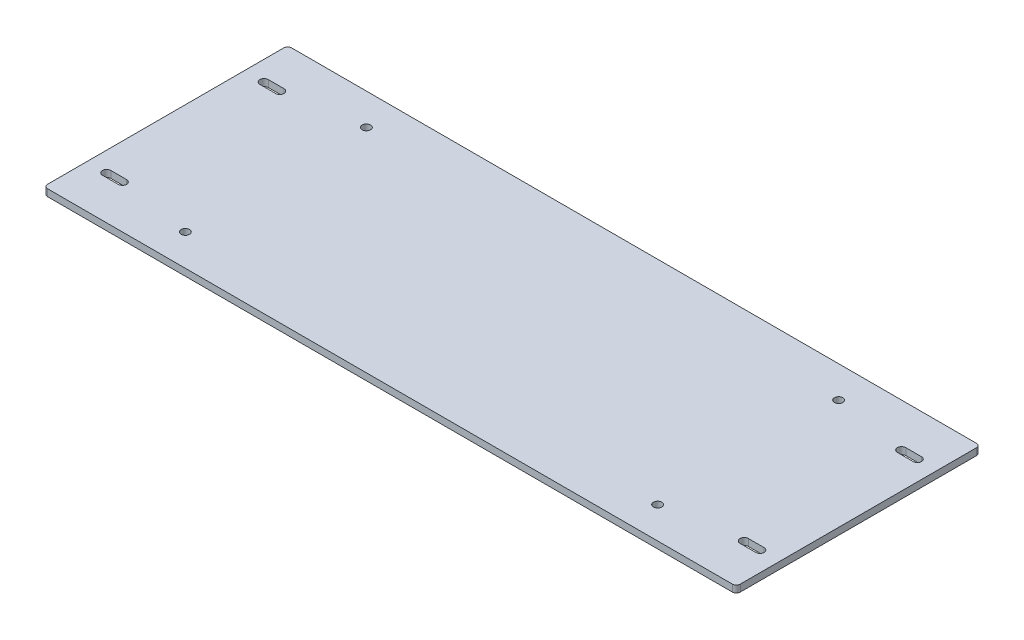
ISO-10303-21;
HEADER;
FILE_DESCRIPTION(('STEP AP214'),'2;1');
FILE_NAME('part.step','',(''),(''),'','','');
FILE_SCHEMA(('AUTOMOTIVE_DESIGN { 1 0 10303 214 1 1 1 1 }'));
ENDSEC;
DATA;
#1=APPLICATION_CONTEXT('core data for automotive mechanical design processes');
#2=APPLICATION_PROTOCOL_DEFINITION('international standard','automotive_design',2000,#1);
#3=PRODUCT_CONTEXT('',#1,'mechanical');
#4=PRODUCT('Part','Part','',(#3));
#5=PRODUCT_RELATED_PRODUCT_CATEGORY('part','',(#4));
#6=PRODUCT_DEFINITION_FORMATION('','',#4);
#7=PRODUCT_DEFINITION_CONTEXT('part definition',#1,'design');
#8=PRODUCT_DEFINITION('design','',#6,#7);
#9=PRODUCT_DEFINITION_SHAPE('','',#8);
#10=(LENGTH_UNIT() NAMED_UNIT(*) SI_UNIT(.MILLI.,.METRE.));
#11=(NAMED_UNIT(*) PLANE_ANGLE_UNIT() SI_UNIT($,.RADIAN.));
#12=(NAMED_UNIT(*) SI_UNIT($,.STERADIAN.) SOLID_ANGLE_UNIT());
#13=UNCERTAINTY_MEASURE_WITH_UNIT(LENGTH_MEASURE(1.E-05),#10,'distance_accuracy_value','');
#14=(GEOMETRIC_REPRESENTATION_CONTEXT(3) GLOBAL_UNCERTAINTY_ASSIGNED_CONTEXT((#13)) GLOBAL_UNIT_ASSIGNED_CONTEXT((#10,
#11,#12)) REPRESENTATION_CONTEXT('',''));
#15=CARTESIAN_POINT('',(0.,0.,0.));
#16=DIRECTION('',(0.,0.,1.));
#17=DIRECTION('',(1.,0.,0.));
#18=AXIS2_PLACEMENT_3D('',#15,#16,#17);
#19=CARTESIAN_POINT('',(0.,5.588,0.));
#20=DIRECTION('',(0.,-1.,0.));
#21=DIRECTION('',(0.,0.,-1.));
#22=AXIS2_PLACEMENT_3D('',#19,#20,#21);
#23=PLANE('',#22);
#24=CARTESIAN_POINT('',(469.9,5.588,-171.45));
#25=DIRECTION('',(0.,1.,0.));
#26=DIRECTION('',(0.,0.,1.));
#27=AXIS2_PLACEMENT_3D('',#24,#25,#26);
#28=CIRCLE('',#27,3.37819999999999);
#29=CARTESIAN_POINT('',(469.9,5.588,-168.0718));
#30=VERTEX_POINT('',#29);
#31=EDGE_CURVE('E870',#30,#30,#28,.T.);
#32=ORIENTED_EDGE('',*,*,#31,.F.);
#33=EDGE_LOOP('',(#32));
#34=FACE_BOUND('',#33,.T.);
#35=CARTESIAN_POINT('',(469.9,5.588,-25.4));
#36=DIRECTION('',(0.,1.,0.));
#37=DIRECTION('',(0.,0.,1.));
#38=AXIS2_PLACEMENT_3D('',#35,#36,#37);
#39=CIRCLE('',#38,3.37819999999999);
#40=CARTESIAN_POINT('',(469.9,5.588,-22.0218));
#41=VERTEX_POINT('',#40);
#42=EDGE_CURVE('E875',#41,#41,#39,.T.);
#43=ORIENTED_EDGE('',*,*,#42,.F.);
#44=EDGE_LOOP('',(#43));
#45=FACE_BOUND('',#44,.T.);
#46=CARTESIAN_POINT('',(88.9000000000001,5.588,-25.4));
#47=DIRECTION('',(0.,1.,0.));
#48=DIRECTION('',(0.,0.,1.));
#49=AXIS2_PLACEMENT_3D('',#46,#47,#48);
#50=CIRCLE('',#49,3.37819999999999);
#51=CARTESIAN_POINT('',(88.9000000000001,5.588,-22.0218));
#52=VERTEX_POINT('',#51);
#53=EDGE_CURVE('E890',#52,#52,#50,.T.);
#54=ORIENTED_EDGE('',*,*,#53,.F.);
#55=EDGE_LOOP('',(#54));
#56=FACE_BOUND('',#55,.T.);
#57=CARTESIAN_POINT('',(88.9,5.588,-171.45));
#58=DIRECTION('',(0.,1.,0.));
#59=DIRECTION('',(0.,0.,1.));
#60=AXIS2_PLACEMENT_3D('',#57,#58,#59);
#61=CIRCLE('',#60,3.37819999999999);
#62=CARTESIAN_POINT('',(88.9,5.588,-168.0718));
#63=VERTEX_POINT('',#62);
#64=EDGE_CURVE('E881',#63,#63,#61,.T.);
#65=ORIENTED_EDGE('',*,*,#64,.F.);
#66=EDGE_LOOP('',(#65));
#67=FACE_BOUND('',#66,.T.);
#68=CARTESIAN_POINT('',(542.925,5.588,-161.925));
#69=DIRECTION('',(0.,1.,0.));
#70=DIRECTION('',(0.,0.,1.));
#71=AXIS2_PLACEMENT_3D('',#68,#69,#70);
#72=CIRCLE('',#71,3.3782);
#73=CARTESIAN_POINT('',(542.925,5.588,-158.5468));
#74=VERTEX_POINT('',#73);
#75=CARTESIAN_POINT('',(542.925,5.588,-165.3032));
#76=VERTEX_POINT('',#75);
#77=EDGE_CURVE('E257',#74,#76,#72,.T.);
#78=ORIENTED_EDGE('',*,*,#77,.F.);
#79=DIRECTION('',(1.,0.,0.));
#80=VECTOR('',#79,1.);
#81=CARTESIAN_POINT('',(542.925,5.588,-158.5468));
#82=LINE('',#81,#80);
#83=CARTESIAN_POINT('',(530.225,5.588,-158.5468));
#84=VERTEX_POINT('',#83);
#85=EDGE_CURVE('E268',#84,#74,#82,.T.);
#86=ORIENTED_EDGE('',*,*,#85,.F.);
#87=CARTESIAN_POINT('',(530.225,5.588,-161.925));
#88=DIRECTION('',(0.,1.,0.));
#89=DIRECTION('',(0.,0.,1.));
#90=AXIS2_PLACEMENT_3D('',#87,#88,#89);
#91=CIRCLE('',#90,3.3782);
#92=CARTESIAN_POINT('',(530.225,5.588,-165.3032));
#93=VERTEX_POINT('',#92);
#94=EDGE_CURVE('E264',#93,#84,#91,.T.);
#95=ORIENTED_EDGE('',*,*,#94,.F.);
#96=DIRECTION('',(-1.,0.,0.));
#97=VECTOR('',#96,1.);
#98=CARTESIAN_POINT('',(542.925,5.588,-165.3032));
#99=LINE('',#98,#97);
#100=EDGE_CURVE('E260',#76,#93,#99,.T.);
#101=ORIENTED_EDGE('',*,*,#100,.F.);
#102=EDGE_LOOP('',(#78,#86,#95,#101));
#103=FACE_BOUND('',#102,.T.);
#104=CARTESIAN_POINT('',(15.875,5.588,-34.925));
#105=DIRECTION('',(0.,1.,0.));
#106=DIRECTION('',(0.,0.,1.));
#107=AXIS2_PLACEMENT_3D('',#104,#105,#106);
#108=CIRCLE('',#107,3.3782);
#109=CARTESIAN_POINT('',(15.875,5.588,-38.3032));
#110=VERTEX_POINT('',#109);
#111=CARTESIAN_POINT('',(15.875,5.588,-31.5468));
#112=VERTEX_POINT('',#111);
#113=EDGE_CURVE('E343',#110,#112,#108,.T.);
#114=ORIENTED_EDGE('',*,*,#113,.F.);
#115=DIRECTION('',(-1.,0.,0.));
#116=VECTOR('',#115,1.);
#117=CARTESIAN_POINT('',(15.875,5.588,-38.3032));
#118=LINE('',#117,#116);
#119=CARTESIAN_POINT('',(28.575,5.588,-38.3032));
#120=VERTEX_POINT('',#119);
#121=EDGE_CURVE('E354',#120,#110,#118,.T.);
#122=ORIENTED_EDGE('',*,*,#121,.F.);
#123=CARTESIAN_POINT('',(28.575,5.588,-34.925));
#124=DIRECTION('',(0.,1.,0.));
#125=DIRECTION('',(0.,0.,1.));
#126=AXIS2_PLACEMENT_3D('',#123,#124,#125);
#127=CIRCLE('',#126,3.3782);
#128=CARTESIAN_POINT('',(28.575,5.588,-31.5468));
#129=VERTEX_POINT('',#128);
#130=EDGE_CURVE('E350',#129,#120,#127,.T.);
#131=ORIENTED_EDGE('',*,*,#130,.F.);
#132=DIRECTION('',(1.,0.,0.));
#133=VECTOR('',#132,1.);
#134=CARTESIAN_POINT('',(15.875,5.588,-31.5468));
#135=LINE('',#134,#133);
#136=EDGE_CURVE('E346',#112,#129,#135,.T.);
#137=ORIENTED_EDGE('',*,*,#136,.F.);
#138=EDGE_LOOP('',(#114,#122,#131,#137));
#139=FACE_BOUND('',#138,.T.);
#140=DIRECTION('',(-1.,0.,0.));
#141=VECTOR('',#140,1.);
#142=CARTESIAN_POINT('',(0.,5.588,-196.85));
#143=LINE('',#142,#141);
#144=CARTESIAN_POINT('',(555.625,5.588,-196.85));
#145=VERTEX_POINT('',#144);
#146=CARTESIAN_POINT('',(3.175,5.588,-196.85));
#147=VERTEX_POINT('',#146);
#148=EDGE_CURVE('E397',#145,#147,#143,.T.);
#149=ORIENTED_EDGE('',*,*,#148,.T.);
#150=CARTESIAN_POINT('',(3.175,5.588,-193.675));
#151=DIRECTION('',(0.,-1.,0.));
#152=DIRECTION('',(0.,0.,-1.));
#153=AXIS2_PLACEMENT_3D('',#150,#151,#152);
#154=CIRCLE('',#153,3.175);
#155=CARTESIAN_POINT('',(0.,5.588,-193.675));
#156=VERTEX_POINT('',#155);
#157=EDGE_CURVE('E448',#147,#156,#154,.F.);
#158=ORIENTED_EDGE('',*,*,#157,.T.);
#159=DIRECTION('',(0.,0.,1.));
#160=VECTOR('',#159,1.);
#161=CARTESIAN_POINT('',(0.,5.588,0.));
#162=LINE('',#161,#160);
#163=CARTESIAN_POINT('',(0.,5.588,-3.175));
#164=VERTEX_POINT('',#163);
#165=EDGE_CURVE('E386',#156,#164,#162,.T.);
#166=ORIENTED_EDGE('',*,*,#165,.T.);
#167=CARTESIAN_POINT('',(3.175,5.588,-3.175));
#168=DIRECTION('',(0.,-1.,0.));
#169=DIRECTION('',(0.,0.,-1.));
#170=AXIS2_PLACEMENT_3D('',#167,#168,#169);
#171=CIRCLE('',#170,3.175);
#172=CARTESIAN_POINT('',(3.175,5.588,0.));
#173=VERTEX_POINT('',#172);
#174=EDGE_CURVE('E442',#164,#173,#171,.F.);
#175=ORIENTED_EDGE('',*,*,#174,.T.);
#176=DIRECTION('',(1.,0.,0.));
#177=VECTOR('',#176,1.);
#178=CARTESIAN_POINT('',(0.,5.588,0.));
#179=LINE('',#178,#177);
#180=CARTESIAN_POINT('',(555.625,5.588,0.));
#181=VERTEX_POINT('',#180);
#182=EDGE_CURVE('E390',#173,#181,#179,.T.);
#183=ORIENTED_EDGE('',*,*,#182,.T.);
#184=CARTESIAN_POINT('',(555.625,5.588,-3.175));
#185=DIRECTION('',(0.,-1.,0.));
#186=DIRECTION('',(0.,0.,-1.));
#187=AXIS2_PLACEMENT_3D('',#184,#185,#186);
#188=CIRCLE('',#187,3.175);
#189=CARTESIAN_POINT('',(558.8,5.588,-3.175));
#190=VERTEX_POINT('',#189);
#191=EDGE_CURVE('E59',#181,#190,#188,.F.);
#192=ORIENTED_EDGE('',*,*,#191,.T.);
#193=DIRECTION('',(0.,0.,-1.));
#194=VECTOR('',#193,1.);
#195=CARTESIAN_POINT('',(558.8,5.588,0.));
#196=LINE('',#195,#194);
#197=CARTESIAN_POINT('',(558.8,5.588,-193.675));
#198=VERTEX_POINT('',#197);
#199=EDGE_CURVE('E394',#190,#198,#196,.T.);
#200=ORIENTED_EDGE('',*,*,#199,.T.);
#201=CARTESIAN_POINT('',(555.625,5.588,-193.675));
#202=DIRECTION('',(0.,-1.,0.));
#203=DIRECTION('',(0.,0.,-1.));
#204=AXIS2_PLACEMENT_3D('',#201,#202,#203);
#205=CIRCLE('',#204,3.175);
#206=EDGE_CURVE('E445',#198,#145,#205,.F.);
#207=ORIENTED_EDGE('',*,*,#206,.T.);
#208=EDGE_LOOP('',(#149,#158,#166,#175,#183,#192,#200,#207));
#209=FACE_BOUND('',#208,.T.);
#210=CARTESIAN_POINT('',(15.875,5.588,-161.925));
#211=DIRECTION('',(0.,1.,0.));
#212=DIRECTION('',(0.,0.,1.));
#213=AXIS2_PLACEMENT_3D('',#210,#211,#212);
#214=CIRCLE('',#213,3.3782);
#215=CARTESIAN_POINT('',(15.875,5.588,-165.3032));
#216=VERTEX_POINT('',#215);
#217=CARTESIAN_POINT('',(15.875,5.588,-158.5468));
#218=VERTEX_POINT('',#217);
#219=EDGE_CURVE('E300',#216,#218,#214,.T.);
#220=ORIENTED_EDGE('',*,*,#219,.F.);
#221=DIRECTION('',(-1.,0.,0.));
#222=VECTOR('',#221,1.);
#223=CARTESIAN_POINT('',(15.875,5.588,-165.3032));
#224=LINE('',#223,#222);
#225=CARTESIAN_POINT('',(28.575,5.588,-165.3032));
#226=VERTEX_POINT('',#225);
#227=EDGE_CURVE('E311',#226,#216,#224,.T.);
#228=ORIENTED_EDGE('',*,*,#227,.F.);
#229=CARTESIAN_POINT('',(28.575,5.588,-161.925));
#230=DIRECTION('',(0.,1.,0.));
#231=DIRECTION('',(0.,0.,1.));
#232=AXIS2_PLACEMENT_3D('',#229,#230,#231);
#233=CIRCLE('',#232,3.3782);
#234=CARTESIAN_POINT('',(28.575,5.588,-158.5468));
#235=VERTEX_POINT('',#234);
#236=EDGE_CURVE('E307',#235,#226,#233,.T.);
#237=ORIENTED_EDGE('',*,*,#236,.F.);
#238=DIRECTION('',(1.,0.,0.));
#239=VECTOR('',#238,1.);
#240=CARTESIAN_POINT('',(15.875,5.588,-158.5468));
#241=LINE('',#240,#239);
#242=EDGE_CURVE('E303',#218,#235,#241,.T.);
#243=ORIENTED_EDGE('',*,*,#242,.F.);
#244=EDGE_LOOP('',(#220,#228,#237,#243));
#245=FACE_BOUND('',#244,.T.);
#246=CARTESIAN_POINT('',(542.925,5.588,-34.925));
#247=DIRECTION('',(0.,1.,0.));
#248=DIRECTION('',(0.,0.,1.));
#249=AXIS2_PLACEMENT_3D('',#246,#247,#248);
#250=CIRCLE('',#249,3.37819999999999);
#251=CARTESIAN_POINT('',(542.925,5.588,-31.5468));
#252=VERTEX_POINT('',#251);
#253=CARTESIAN_POINT('',(542.925,5.588,-38.3032));
#254=VERTEX_POINT('',#253);
#255=EDGE_CURVE('E201',#252,#254,#250,.T.);
#256=ORIENTED_EDGE('',*,*,#255,.F.);
#257=DIRECTION('',(1.,0.,0.));
#258=VECTOR('',#257,1.);
#259=CARTESIAN_POINT('',(542.925,5.588,-31.5468));
#260=LINE('',#259,#258);
#261=CARTESIAN_POINT('',(530.225,5.588,-31.5468));
#262=VERTEX_POINT('',#261);
#263=EDGE_CURVE('E231',#262,#252,#260,.T.);
#264=ORIENTED_EDGE('',*,*,#263,.F.);
#265=CARTESIAN_POINT('',(530.225,5.588,-34.925));
#266=DIRECTION('',(0.,1.,0.));
#267=DIRECTION('',(0.,0.,1.));
#268=AXIS2_PLACEMENT_3D('',#265,#266,#267);
#269=CIRCLE('',#268,3.37819999999999);
#270=CARTESIAN_POINT('',(530.225,5.588,-38.3032));
#271=VERTEX_POINT('',#270);
#272=EDGE_CURVE('E226',#271,#262,#269,.T.);
#273=ORIENTED_EDGE('',*,*,#272,.F.);
#274=DIRECTION('',(-1.,0.,0.));
#275=VECTOR('',#274,1.);
#276=CARTESIAN_POINT('',(542.925,5.588,-38.3032));
#277=LINE('',#276,#275);
#278=EDGE_CURVE('E212',#254,#271,#277,.T.);
#279=ORIENTED_EDGE('',*,*,#278,.F.);
#280=EDGE_LOOP('',(#256,#264,#273,#279));
#281=FACE_BOUND('',#280,.T.);
#282=ADVANCED_FACE('F36',(#34,#45,#56,#67,#103,#139,#209,#245,#281),#23,.F.);
#283=CARTESIAN_POINT('',(0.,0.,0.));
#284=DIRECTION('',(0.,-1.,0.));
#285=DIRECTION('',(0.,0.,-1.));
#286=AXIS2_PLACEMENT_3D('',#283,#284,#285);
#287=PLANE('',#286);
#288=CARTESIAN_POINT('',(469.9,0.,-171.45));
#289=DIRECTION('',(0.,1.,0.));
#290=DIRECTION('',(0.,0.,1.));
#291=AXIS2_PLACEMENT_3D('',#288,#289,#290);
#292=CIRCLE('',#291,3.37819999999999);
#293=CARTESIAN_POINT('',(469.9,0.,-168.0718));
#294=VERTEX_POINT('',#293);
#295=EDGE_CURVE('E868',#294,#294,#292,.T.);
#296=ORIENTED_EDGE('',*,*,#295,.T.);
#297=EDGE_LOOP('',(#296));
#298=FACE_BOUND('',#297,.T.);
#299=CARTESIAN_POINT('',(469.9,0.,-25.4));
#300=DIRECTION('',(0.,1.,0.));
#301=DIRECTION('',(0.,0.,1.));
#302=AXIS2_PLACEMENT_3D('',#299,#300,#301);
#303=CIRCLE('',#302,3.37819999999999);
#304=CARTESIAN_POINT('',(469.9,0.,-22.0218));
#305=VERTEX_POINT('',#304);
#306=EDGE_CURVE('E897',#305,#305,#303,.T.);
#307=ORIENTED_EDGE('',*,*,#306,.T.);
#308=EDGE_LOOP('',(#307));
#309=FACE_BOUND('',#308,.T.);
#310=CARTESIAN_POINT('',(88.9000000000001,0.,-25.4));
#311=DIRECTION('',(0.,1.,0.));
#312=DIRECTION('',(0.,0.,1.));
#313=AXIS2_PLACEMENT_3D('',#310,#311,#312);
#314=CIRCLE('',#313,3.37819999999999);
#315=CARTESIAN_POINT('',(88.9000000000001,0.,-22.0218));
#316=VERTEX_POINT('',#315);
#317=EDGE_CURVE('E884',#316,#316,#314,.T.);
#318=ORIENTED_EDGE('',*,*,#317,.T.);
#319=EDGE_LOOP('',(#318));
#320=FACE_BOUND('',#319,.T.);
#321=CARTESIAN_POINT('',(88.9,0.,-171.45));
#322=DIRECTION('',(0.,1.,0.));
#323=DIRECTION('',(0.,0.,1.));
#324=AXIS2_PLACEMENT_3D('',#321,#322,#323);
#325=CIRCLE('',#324,3.37819999999999);
#326=CARTESIAN_POINT('',(88.9,0.,-168.0718));
#327=VERTEX_POINT('',#326);
#328=EDGE_CURVE('E240',#327,#327,#325,.T.);
#329=ORIENTED_EDGE('',*,*,#328,.T.);
#330=EDGE_LOOP('',(#329));
#331=FACE_BOUND('',#330,.T.);
#332=DIRECTION('',(0.,0.,1.));
#333=VECTOR('',#332,1.);
#334=CARTESIAN_POINT('',(0.,0.,0.));
#335=LINE('',#334,#333);
#336=CARTESIAN_POINT('',(0.,0.,-193.675));
#337=VERTEX_POINT('',#336);
#338=CARTESIAN_POINT('',(0.,0.,-3.175));
#339=VERTEX_POINT('',#338);
#340=EDGE_CURVE('E385',#337,#339,#335,.T.);
#341=ORIENTED_EDGE('',*,*,#340,.F.);
#342=CARTESIAN_POINT('',(3.175,0.,-193.675));
#343=DIRECTION('',(0.,-1.,0.));
#344=DIRECTION('',(0.,0.,-1.));
#345=AXIS2_PLACEMENT_3D('',#342,#343,#344);
#346=CIRCLE('',#345,3.175);
#347=CARTESIAN_POINT('',(3.175,0.,-196.85));
#348=VERTEX_POINT('',#347);
#349=EDGE_CURVE('E430',#337,#348,#346,.T.);
#350=ORIENTED_EDGE('',*,*,#349,.T.);
#351=DIRECTION('',(-1.,0.,0.));
#352=VECTOR('',#351,1.);
#353=CARTESIAN_POINT('',(0.,0.,-196.85));
#354=LINE('',#353,#352);
#355=CARTESIAN_POINT('',(555.625,0.,-196.85));
#356=VERTEX_POINT('',#355);
#357=EDGE_CURVE('E391',#356,#348,#354,.T.);
#358=ORIENTED_EDGE('',*,*,#357,.F.);
#359=CARTESIAN_POINT('',(555.625,0.,-193.675));
#360=DIRECTION('',(0.,-1.,0.));
#361=DIRECTION('',(0.,0.,-1.));
#362=AXIS2_PLACEMENT_3D('',#359,#360,#361);
#363=CIRCLE('',#362,3.175);
#364=CARTESIAN_POINT('',(558.8,0.,-193.675));
#365=VERTEX_POINT('',#364);
#366=EDGE_CURVE('E427',#356,#365,#363,.T.);
#367=ORIENTED_EDGE('',*,*,#366,.T.);
#368=DIRECTION('',(0.,0.,-1.));
#369=VECTOR('',#368,1.);
#370=CARTESIAN_POINT('',(558.8,0.,0.));
#371=LINE('',#370,#369);
#372=CARTESIAN_POINT('',(558.8,0.,-3.175));
#373=VERTEX_POINT('',#372);
#374=EDGE_CURVE('E409',#373,#365,#371,.T.);
#375=ORIENTED_EDGE('',*,*,#374,.F.);
#376=CARTESIAN_POINT('',(555.625,0.,-3.175));
#377=DIRECTION('',(0.,-1.,0.));
#378=DIRECTION('',(0.,0.,-1.));
#379=AXIS2_PLACEMENT_3D('',#376,#377,#378);
#380=CIRCLE('',#379,3.175);
#381=CARTESIAN_POINT('',(555.625,0.,0.));
#382=VERTEX_POINT('',#381);
#383=EDGE_CURVE('E421',#373,#382,#380,.T.);
#384=ORIENTED_EDGE('',*,*,#383,.T.);
#385=DIRECTION('',(1.,0.,0.));
#386=VECTOR('',#385,1.);
#387=CARTESIAN_POINT('',(0.,0.,0.));
#388=LINE('',#387,#386);
#389=CARTESIAN_POINT('',(3.175,0.,0.));
#390=VERTEX_POINT('',#389);
#391=EDGE_CURVE('E405',#390,#382,#388,.T.);
#392=ORIENTED_EDGE('',*,*,#391,.F.);
#393=CARTESIAN_POINT('',(3.175,0.,-3.175));
#394=DIRECTION('',(0.,-1.,0.));
#395=DIRECTION('',(0.,0.,-1.));
#396=AXIS2_PLACEMENT_3D('',#393,#394,#395);
#397=CIRCLE('',#396,3.175);
#398=EDGE_CURVE('E424',#390,#339,#397,.T.);
#399=ORIENTED_EDGE('',*,*,#398,.T.);
#400=EDGE_LOOP('',(#341,#350,#358,#367,#375,#384,#392,#399));
#401=FACE_BOUND('',#400,.T.);
#402=DIRECTION('',(-1.,0.,0.));
#403=VECTOR('',#402,1.);
#404=CARTESIAN_POINT('',(15.875,0.,-38.3032));
#405=LINE('',#404,#403);
#406=CARTESIAN_POINT('',(28.575,0.,-38.3032));
#407=VERTEX_POINT('',#406);
#408=CARTESIAN_POINT('',(15.875,0.,-38.3032));
#409=VERTEX_POINT('',#408);
#410=EDGE_CURVE('E347',#407,#409,#405,.T.);
#411=ORIENTED_EDGE('',*,*,#410,.T.);
#412=CARTESIAN_POINT('',(15.875,0.,-34.925));
#413=DIRECTION('',(0.,1.,0.));
#414=DIRECTION('',(0.,0.,1.));
#415=AXIS2_PLACEMENT_3D('',#412,#413,#414);
#416=CIRCLE('',#415,3.3782);
#417=CARTESIAN_POINT('',(15.875,0.,-31.5468));
#418=VERTEX_POINT('',#417);
#419=EDGE_CURVE('E342',#409,#418,#416,.T.);
#420=ORIENTED_EDGE('',*,*,#419,.T.);
#421=DIRECTION('',(1.,0.,0.));
#422=VECTOR('',#421,1.);
#423=CARTESIAN_POINT('',(15.875,0.,-31.5468));
#424=LINE('',#423,#422);
#425=CARTESIAN_POINT('',(28.575,0.,-31.5468));
#426=VERTEX_POINT('',#425);
#427=EDGE_CURVE('E361',#418,#426,#424,.T.);
#428=ORIENTED_EDGE('',*,*,#427,.T.);
#429=CARTESIAN_POINT('',(28.575,0.,-34.925));
#430=DIRECTION('',(0.,1.,0.));
#431=DIRECTION('',(0.,0.,1.));
#432=AXIS2_PLACEMENT_3D('',#429,#430,#431);
#433=CIRCLE('',#432,3.3782);
#434=EDGE_CURVE('E365',#426,#407,#433,.T.);
#435=ORIENTED_EDGE('',*,*,#434,.T.);
#436=EDGE_LOOP('',(#411,#420,#428,#435));
#437=FACE_BOUND('',#436,.T.);
#438=DIRECTION('',(-1.,0.,0.));
#439=VECTOR('',#438,1.);
#440=CARTESIAN_POINT('',(15.875,0.,-165.3032));
#441=LINE('',#440,#439);
#442=CARTESIAN_POINT('',(28.575,0.,-165.3032));
#443=VERTEX_POINT('',#442);
#444=CARTESIAN_POINT('',(15.875,0.,-165.3032));
#445=VERTEX_POINT('',#444);
#446=EDGE_CURVE('E304',#443,#445,#441,.T.);
#447=ORIENTED_EDGE('',*,*,#446,.T.);
#448=CARTESIAN_POINT('',(15.875,0.,-161.925));
#449=DIRECTION('',(0.,1.,0.));
#450=DIRECTION('',(0.,0.,1.));
#451=AXIS2_PLACEMENT_3D('',#448,#449,#450);
#452=CIRCLE('',#451,3.3782);
#453=CARTESIAN_POINT('',(15.875,0.,-158.5468));
#454=VERTEX_POINT('',#453);
#455=EDGE_CURVE('E299',#445,#454,#452,.T.);
#456=ORIENTED_EDGE('',*,*,#455,.T.);
#457=DIRECTION('',(1.,0.,0.));
#458=VECTOR('',#457,1.);
#459=CARTESIAN_POINT('',(15.875,0.,-158.5468));
#460=LINE('',#459,#458);
#461=CARTESIAN_POINT('',(28.575,0.,-158.5468));
#462=VERTEX_POINT('',#461);
#463=EDGE_CURVE('E318',#454,#462,#460,.T.);
#464=ORIENTED_EDGE('',*,*,#463,.T.);
#465=CARTESIAN_POINT('',(28.575,0.,-161.925));
#466=DIRECTION('',(0.,1.,0.));
#467=DIRECTION('',(0.,0.,1.));
#468=AXIS2_PLACEMENT_3D('',#465,#466,#467);
#469=CIRCLE('',#468,3.3782);
#470=EDGE_CURVE('E322',#462,#443,#469,.T.);
#471=ORIENTED_EDGE('',*,*,#470,.T.);
#472=EDGE_LOOP('',(#447,#456,#464,#471));
#473=FACE_BOUND('',#472,.T.);
#474=DIRECTION('',(1.,0.,0.));
#475=VECTOR('',#474,1.);
#476=CARTESIAN_POINT('',(542.925,0.,-158.5468));
#477=LINE('',#476,#475);
#478=CARTESIAN_POINT('',(530.225,0.,-158.5468));
#479=VERTEX_POINT('',#478);
#480=CARTESIAN_POINT('',(542.925,0.,-158.5468));
#481=VERTEX_POINT('',#480);
#482=EDGE_CURVE('E261',#479,#481,#477,.T.);
#483=ORIENTED_EDGE('',*,*,#482,.T.);
#484=CARTESIAN_POINT('',(542.925,0.,-161.925));
#485=DIRECTION('',(0.,1.,0.));
#486=DIRECTION('',(0.,0.,1.));
#487=AXIS2_PLACEMENT_3D('',#484,#485,#486);
#488=CIRCLE('',#487,3.3782);
#489=CARTESIAN_POINT('',(542.925,0.,-165.3032));
#490=VERTEX_POINT('',#489);
#491=EDGE_CURVE('E221',#481,#490,#488,.T.);
#492=ORIENTED_EDGE('',*,*,#491,.T.);
#493=DIRECTION('',(-1.,0.,0.));
#494=VECTOR('',#493,1.);
#495=CARTESIAN_POINT('',(542.925,0.,-165.3032));
#496=LINE('',#495,#494);
#497=CARTESIAN_POINT('',(530.225,0.,-165.3032));
#498=VERTEX_POINT('',#497);
#499=EDGE_CURVE('E275',#490,#498,#496,.T.);
#500=ORIENTED_EDGE('',*,*,#499,.T.);
#501=CARTESIAN_POINT('',(530.225,0.,-161.925));
#502=DIRECTION('',(0.,1.,0.));
#503=DIRECTION('',(0.,0.,1.));
#504=AXIS2_PLACEMENT_3D('',#501,#502,#503);
#505=CIRCLE('',#504,3.3782);
#506=EDGE_CURVE('E279',#498,#479,#505,.T.);
#507=ORIENTED_EDGE('',*,*,#506,.T.);
#508=EDGE_LOOP('',(#483,#492,#500,#507));
#509=FACE_BOUND('',#508,.T.);
#510=DIRECTION('',(1.,0.,0.));
#511=VECTOR('',#510,1.);
#512=CARTESIAN_POINT('',(542.925,0.,-31.5468));
#513=LINE('',#512,#511);
#514=CARTESIAN_POINT('',(530.225,0.,-31.5468));
#515=VERTEX_POINT('',#514);
#516=CARTESIAN_POINT('',(542.925,0.,-31.5468));
#517=VERTEX_POINT('',#516);
#518=EDGE_CURVE('E213',#515,#517,#513,.T.);
#519=ORIENTED_EDGE('',*,*,#518,.T.);
#520=CARTESIAN_POINT('',(542.925,0.,-34.925));
#521=DIRECTION('',(0.,1.,0.));
#522=DIRECTION('',(0.,0.,1.));
#523=AXIS2_PLACEMENT_3D('',#520,#521,#522);
#524=CIRCLE('',#523,3.37819999999999);
#525=CARTESIAN_POINT('',(542.925,0.,-38.3032));
#526=VERTEX_POINT('',#525);
#527=EDGE_CURVE('E237',#517,#526,#524,.T.);
#528=ORIENTED_EDGE('',*,*,#527,.T.);
#529=DIRECTION('',(-1.,0.,0.));
#530=VECTOR('',#529,1.);
#531=CARTESIAN_POINT('',(542.925,0.,-38.3032));
#532=LINE('',#531,#530);
#533=CARTESIAN_POINT('',(530.225,0.,-38.3032));
#534=VERTEX_POINT('',#533);
#535=EDGE_CURVE('E219',#526,#534,#532,.T.);
#536=ORIENTED_EDGE('',*,*,#535,.T.);
#537=CARTESIAN_POINT('',(530.225,0.,-34.925));
#538=DIRECTION('',(0.,1.,0.));
#539=DIRECTION('',(0.,0.,1.));
#540=AXIS2_PLACEMENT_3D('',#537,#538,#539);
#541=CIRCLE('',#540,3.37819999999999);
#542=EDGE_CURVE('E243',#534,#515,#541,.T.);
#543=ORIENTED_EDGE('',*,*,#542,.T.);
#544=EDGE_LOOP('',(#519,#528,#536,#543));
#545=FACE_BOUND('',#544,.T.);
#546=ADVANCED_FACE('F472',(#298,#309,#320,#331,#401,#437,#473,#509,#545),#287,.T.);
#547=CARTESIAN_POINT('',(0.,5.588,0.));
#548=DIRECTION('',(1.,0.,0.));
#549=DIRECTION('',(0.,0.,-1.));
#550=AXIS2_PLACEMENT_3D('',#547,#548,#549);
#551=PLANE('',#550);
#552=ORIENTED_EDGE('',*,*,#165,.F.);
#553=DIRECTION('',(0.,-1.,0.));
#554=VECTOR('',#553,1.);
#555=CARTESIAN_POINT('',(0.,5.588,-193.675));
#556=LINE('',#555,#554);
#557=EDGE_CURVE('E417',#156,#337,#556,.T.);
#558=ORIENTED_EDGE('',*,*,#557,.T.);
#559=ORIENTED_EDGE('',*,*,#340,.T.);
#560=DIRECTION('',(0.,-1.,0.));
#561=VECTOR('',#560,1.);
#562=CARTESIAN_POINT('',(0.,5.588,-3.175));
#563=LINE('',#562,#561);
#564=EDGE_CURVE('E401',#339,#164,#563,.F.);
#565=ORIENTED_EDGE('',*,*,#564,.T.);
#566=EDGE_LOOP('',(#552,#558,#559,#565));
#567=FACE_BOUND('',#566,.T.);
#568=ADVANCED_FACE('F489',(#567),#551,.F.);
#569=CARTESIAN_POINT('',(0.,5.588,0.));
#570=DIRECTION('',(0.,0.,-1.));
#571=DIRECTION('',(-1.,0.,0.));
#572=AXIS2_PLACEMENT_3D('',#569,#570,#571);
#573=PLANE('',#572);
#574=ORIENTED_EDGE('',*,*,#182,.F.);
#575=DIRECTION('',(0.,-1.,0.));
#576=VECTOR('',#575,1.);
#577=CARTESIAN_POINT('',(3.175,5.588,0.));
#578=LINE('',#577,#576);
#579=EDGE_CURVE('E11',#173,#390,#578,.T.);
#580=ORIENTED_EDGE('',*,*,#579,.T.);
#581=ORIENTED_EDGE('',*,*,#391,.T.);
#582=DIRECTION('',(0.,-1.,0.));
#583=VECTOR('',#582,1.);
#584=CARTESIAN_POINT('',(555.625,5.588,0.));
#585=LINE('',#584,#583);
#586=EDGE_CURVE('E45',#382,#181,#585,.F.);
#587=ORIENTED_EDGE('',*,*,#586,.T.);
#588=EDGE_LOOP('',(#574,#580,#581,#587));
#589=FACE_BOUND('',#588,.T.);
#590=ADVANCED_FACE('F461',(#589),#573,.F.);
#591=CARTESIAN_POINT('',(558.8,5.588,0.));
#592=DIRECTION('',(-1.,0.,0.));
#593=DIRECTION('',(0.,0.,1.));
#594=AXIS2_PLACEMENT_3D('',#591,#592,#593);
#595=PLANE('',#594);
#596=ORIENTED_EDGE('',*,*,#374,.T.);
#597=DIRECTION('',(0.,-1.,0.));
#598=VECTOR('',#597,1.);
#599=CARTESIAN_POINT('',(558.8,5.588,-193.675));
#600=LINE('',#599,#598);
#601=EDGE_CURVE('E52',#365,#198,#600,.F.);
#602=ORIENTED_EDGE('',*,*,#601,.T.);
#603=ORIENTED_EDGE('',*,*,#199,.F.);
#604=DIRECTION('',(0.,-1.,0.));
#605=VECTOR('',#604,1.);
#606=CARTESIAN_POINT('',(558.8,5.588,-3.175));
#607=LINE('',#606,#605);
#608=EDGE_CURVE('E451',#190,#373,#607,.T.);
#609=ORIENTED_EDGE('',*,*,#608,.T.);
#610=EDGE_LOOP('',(#596,#602,#603,#609));
#611=FACE_BOUND('',#610,.T.);
#612=ADVANCED_FACE('F469',(#611),#595,.F.);
#613=CARTESIAN_POINT('',(0.,5.588,-196.85));
#614=DIRECTION('',(0.,0.,1.));
#615=DIRECTION('',(1.,0.,0.));
#616=AXIS2_PLACEMENT_3D('',#613,#614,#615);
#617=PLANE('',#616);
#618=ORIENTED_EDGE('',*,*,#357,.T.);
#619=DIRECTION('',(0.,-1.,0.));
#620=VECTOR('',#619,1.);
#621=CARTESIAN_POINT('',(3.175,5.588,-196.85));
#622=LINE('',#621,#620);
#623=EDGE_CURVE('E437',#348,#147,#622,.F.);
#624=ORIENTED_EDGE('',*,*,#623,.T.);
#625=ORIENTED_EDGE('',*,*,#148,.F.);
#626=DIRECTION('',(0.,-1.,0.));
#627=VECTOR('',#626,1.);
#628=CARTESIAN_POINT('',(555.625,5.588,-196.85));
#629=LINE('',#628,#627);
#630=EDGE_CURVE('E433',#145,#356,#629,.T.);
#631=ORIENTED_EDGE('',*,*,#630,.T.);
#632=EDGE_LOOP('',(#618,#624,#625,#631));
#633=FACE_BOUND('',#632,.T.);
#634=ADVANCED_FACE('F481',(#633),#617,.F.);
#635=CARTESIAN_POINT('',(15.875,5.588,-34.925));
#636=DIRECTION('',(0.,-1.,0.));
#637=DIRECTION('',(0.,0.,-1.));
#638=AXIS2_PLACEMENT_3D('',#635,#636,#637);
#639=CYLINDRICAL_SURFACE('',#638,3.3782);
#640=ORIENTED_EDGE('',*,*,#419,.F.);
#641=DIRECTION('',(0.,-1.,0.));
#642=VECTOR('',#641,1.);
#643=CARTESIAN_POINT('',(15.875,5.588,-38.3032));
#644=LINE('',#643,#642);
#645=EDGE_CURVE('E357',#110,#409,#644,.T.);
#646=ORIENTED_EDGE('',*,*,#645,.F.);
#647=ORIENTED_EDGE('',*,*,#113,.T.);
#648=DIRECTION('',(0.,-1.,0.));
#649=VECTOR('',#648,1.);
#650=CARTESIAN_POINT('',(15.875,5.588,-31.5468));
#651=LINE('',#650,#649);
#652=EDGE_CURVE('E381',#112,#418,#651,.T.);
#653=ORIENTED_EDGE('',*,*,#652,.T.);
#654=EDGE_LOOP('',(#640,#646,#647,#653));
#655=FACE_BOUND('',#654,.T.);
#656=ADVANCED_FACE('F511',(#655),#639,.F.);
#657=CARTESIAN_POINT('',(15.875,5.588,-31.5468));
#658=DIRECTION('',(0.,0.,-1.));
#659=DIRECTION('',(-1.,0.,0.));
#660=AXIS2_PLACEMENT_3D('',#657,#658,#659);
#661=PLANE('',#660);
#662=ORIENTED_EDGE('',*,*,#427,.F.);
#663=ORIENTED_EDGE('',*,*,#652,.F.);
#664=ORIENTED_EDGE('',*,*,#136,.T.);
#665=DIRECTION('',(0.,-1.,0.));
#666=VECTOR('',#665,1.);
#667=CARTESIAN_POINT('',(28.575,5.588,-31.5468));
#668=LINE('',#667,#666);
#669=EDGE_CURVE('E378',#129,#426,#668,.T.);
#670=ORIENTED_EDGE('',*,*,#669,.T.);
#671=EDGE_LOOP('',(#662,#663,#664,#670));
#672=FACE_BOUND('',#671,.T.);
#673=ADVANCED_FACE('F581',(#672),#661,.T.);
#674=CARTESIAN_POINT('',(28.575,5.588,-34.925));
#675=DIRECTION('',(0.,-1.,0.));
#676=DIRECTION('',(0.,0.,-1.));
#677=AXIS2_PLACEMENT_3D('',#674,#675,#676);
#678=CYLINDRICAL_SURFACE('',#677,3.3782);
#679=ORIENTED_EDGE('',*,*,#434,.F.);
#680=ORIENTED_EDGE('',*,*,#669,.F.);
#681=ORIENTED_EDGE('',*,*,#130,.T.);
#682=DIRECTION('',(0.,-1.,0.));
#683=VECTOR('',#682,1.);
#684=CARTESIAN_POINT('',(28.575,5.588,-38.3032));
#685=LINE('',#684,#683);
#686=EDGE_CURVE('E375',#120,#407,#685,.T.);
#687=ORIENTED_EDGE('',*,*,#686,.T.);
#688=EDGE_LOOP('',(#679,#680,#681,#687));
#689=FACE_BOUND('',#688,.T.);
#690=ADVANCED_FACE('F578',(#689),#678,.F.);
#691=CARTESIAN_POINT('',(15.875,5.588,-38.3032));
#692=DIRECTION('',(0.,0.,1.));
#693=DIRECTION('',(1.,0.,0.));
#694=AXIS2_PLACEMENT_3D('',#691,#692,#693);
#695=PLANE('',#694);
#696=ORIENTED_EDGE('',*,*,#410,.F.);
#697=ORIENTED_EDGE('',*,*,#686,.F.);
#698=ORIENTED_EDGE('',*,*,#121,.T.);
#699=ORIENTED_EDGE('',*,*,#645,.T.);
#700=EDGE_LOOP('',(#696,#697,#698,#699));
#701=FACE_BOUND('',#700,.T.);
#702=ADVANCED_FACE('F574',(#701),#695,.T.);
#703=CARTESIAN_POINT('',(15.875,5.588,-161.925));
#704=DIRECTION('',(0.,-1.,0.));
#705=DIRECTION('',(0.,0.,-1.));
#706=AXIS2_PLACEMENT_3D('',#703,#704,#705);
#707=CYLINDRICAL_SURFACE('',#706,3.3782);
#708=ORIENTED_EDGE('',*,*,#455,.F.);
#709=DIRECTION('',(0.,-1.,0.));
#710=VECTOR('',#709,1.);
#711=CARTESIAN_POINT('',(15.875,5.588,-165.3032));
#712=LINE('',#711,#710);
#713=EDGE_CURVE('E314',#216,#445,#712,.T.);
#714=ORIENTED_EDGE('',*,*,#713,.F.);
#715=ORIENTED_EDGE('',*,*,#219,.T.);
#716=DIRECTION('',(0.,-1.,0.));
#717=VECTOR('',#716,1.);
#718=CARTESIAN_POINT('',(15.875,5.588,-158.5468));
#719=LINE('',#718,#717);
#720=EDGE_CURVE('E338',#218,#454,#719,.T.);
#721=ORIENTED_EDGE('',*,*,#720,.T.);
#722=EDGE_LOOP('',(#708,#714,#715,#721));
#723=FACE_BOUND('',#722,.T.);
#724=ADVANCED_FACE('F570',(#723),#707,.F.);
#725=CARTESIAN_POINT('',(15.875,5.588,-158.5468));
#726=DIRECTION('',(0.,0.,-1.));
#727=DIRECTION('',(-1.,0.,0.));
#728=AXIS2_PLACEMENT_3D('',#725,#726,#727);
#729=PLANE('',#728);
#730=ORIENTED_EDGE('',*,*,#463,.F.);
#731=ORIENTED_EDGE('',*,*,#720,.F.);
#732=ORIENTED_EDGE('',*,*,#242,.T.);
#733=DIRECTION('',(0.,-1.,0.));
#734=VECTOR('',#733,1.);
#735=CARTESIAN_POINT('',(28.575,5.588,-158.5468));
#736=LINE('',#735,#734);
#737=EDGE_CURVE('E335',#235,#462,#736,.T.);
#738=ORIENTED_EDGE('',*,*,#737,.T.);
#739=EDGE_LOOP('',(#730,#731,#732,#738));
#740=FACE_BOUND('',#739,.T.);
#741=ADVANCED_FACE('F566',(#740),#729,.T.);
#742=CARTESIAN_POINT('',(28.575,5.588,-161.925));
#743=DIRECTION('',(0.,-1.,0.));
#744=DIRECTION('',(0.,0.,-1.));
#745=AXIS2_PLACEMENT_3D('',#742,#743,#744);
#746=CYLINDRICAL_SURFACE('',#745,3.3782);
#747=ORIENTED_EDGE('',*,*,#470,.F.);
#748=ORIENTED_EDGE('',*,*,#737,.F.);
#749=ORIENTED_EDGE('',*,*,#236,.T.);
#750=DIRECTION('',(0.,-1.,0.));
#751=VECTOR('',#750,1.);
#752=CARTESIAN_POINT('',(28.575,5.588,-165.3032));
#753=LINE('',#752,#751);
#754=EDGE_CURVE('E332',#226,#443,#753,.T.);
#755=ORIENTED_EDGE('',*,*,#754,.T.);
#756=EDGE_LOOP('',(#747,#748,#749,#755));
#757=FACE_BOUND('',#756,.T.);
#758=ADVANCED_FACE('F562',(#757),#746,.F.);
#759=CARTESIAN_POINT('',(15.875,5.588,-165.3032));
#760=DIRECTION('',(0.,0.,1.));
#761=DIRECTION('',(1.,0.,0.));
#762=AXIS2_PLACEMENT_3D('',#759,#760,#761);
#763=PLANE('',#762);
#764=ORIENTED_EDGE('',*,*,#446,.F.);
#765=ORIENTED_EDGE('',*,*,#754,.F.);
#766=ORIENTED_EDGE('',*,*,#227,.T.);
#767=ORIENTED_EDGE('',*,*,#713,.T.);
#768=EDGE_LOOP('',(#764,#765,#766,#767));
#769=FACE_BOUND('',#768,.T.);
#770=ADVANCED_FACE('F558',(#769),#763,.T.);
#771=CARTESIAN_POINT('',(542.925,5.588,-161.925));
#772=DIRECTION('',(0.,-1.,0.));
#773=DIRECTION('',(0.,0.,-1.));
#774=AXIS2_PLACEMENT_3D('',#771,#772,#773);
#775=CYLINDRICAL_SURFACE('',#774,3.3782);
#776=ORIENTED_EDGE('',*,*,#491,.F.);
#777=DIRECTION('',(0.,-1.,0.));
#778=VECTOR('',#777,1.);
#779=CARTESIAN_POINT('',(542.925,5.588,-158.5468));
#780=LINE('',#779,#778);
#781=EDGE_CURVE('E271',#74,#481,#780,.T.);
#782=ORIENTED_EDGE('',*,*,#781,.F.);
#783=ORIENTED_EDGE('',*,*,#77,.T.);
#784=DIRECTION('',(0.,-1.,0.));
#785=VECTOR('',#784,1.);
#786=CARTESIAN_POINT('',(542.925,5.588,-165.3032));
#787=LINE('',#786,#785);
#788=EDGE_CURVE('E295',#76,#490,#787,.T.);
#789=ORIENTED_EDGE('',*,*,#788,.T.);
#790=EDGE_LOOP('',(#776,#782,#783,#789));
#791=FACE_BOUND('',#790,.T.);
#792=ADVANCED_FACE('F554',(#791),#775,.F.);
#793=CARTESIAN_POINT('',(542.925,5.588,-165.3032));
#794=DIRECTION('',(0.,0.,1.));
#795=DIRECTION('',(1.,0.,0.));
#796=AXIS2_PLACEMENT_3D('',#793,#794,#795);
#797=PLANE('',#796);
#798=ORIENTED_EDGE('',*,*,#499,.F.);
#799=ORIENTED_EDGE('',*,*,#788,.F.);
#800=ORIENTED_EDGE('',*,*,#100,.T.);
#801=DIRECTION('',(0.,-1.,0.));
#802=VECTOR('',#801,1.);
#803=CARTESIAN_POINT('',(530.225,5.588,-165.3032));
#804=LINE('',#803,#802);
#805=EDGE_CURVE('E292',#93,#498,#804,.T.);
#806=ORIENTED_EDGE('',*,*,#805,.T.);
#807=EDGE_LOOP('',(#798,#799,#800,#806));
#808=FACE_BOUND('',#807,.T.);
#809=ADVANCED_FACE('F550',(#808),#797,.T.);
#810=CARTESIAN_POINT('',(530.225,5.588,-161.925));
#811=DIRECTION('',(0.,-1.,0.));
#812=DIRECTION('',(0.,0.,-1.));
#813=AXIS2_PLACEMENT_3D('',#810,#811,#812);
#814=CYLINDRICAL_SURFACE('',#813,3.3782);
#815=ORIENTED_EDGE('',*,*,#506,.F.);
#816=ORIENTED_EDGE('',*,*,#805,.F.);
#817=ORIENTED_EDGE('',*,*,#94,.T.);
#818=DIRECTION('',(0.,-1.,0.));
#819=VECTOR('',#818,1.);
#820=CARTESIAN_POINT('',(530.225,5.588,-158.5468));
#821=LINE('',#820,#819);
#822=EDGE_CURVE('E289',#84,#479,#821,.T.);
#823=ORIENTED_EDGE('',*,*,#822,.T.);
#824=EDGE_LOOP('',(#815,#816,#817,#823));
#825=FACE_BOUND('',#824,.T.);
#826=ADVANCED_FACE('F546',(#825),#814,.F.);
#827=CARTESIAN_POINT('',(542.925,5.588,-158.5468));
#828=DIRECTION('',(0.,0.,-1.));
#829=DIRECTION('',(-1.,0.,0.));
#830=AXIS2_PLACEMENT_3D('',#827,#828,#829);
#831=PLANE('',#830);
#832=ORIENTED_EDGE('',*,*,#482,.F.);
#833=ORIENTED_EDGE('',*,*,#822,.F.);
#834=ORIENTED_EDGE('',*,*,#85,.T.);
#835=ORIENTED_EDGE('',*,*,#781,.T.);
#836=EDGE_LOOP('',(#832,#833,#834,#835));
#837=FACE_BOUND('',#836,.T.);
#838=ADVANCED_FACE('F543',(#837),#831,.T.);
#839=CARTESIAN_POINT('',(542.925,5.588,-34.925));
#840=DIRECTION('',(0.,-1.,0.));
#841=DIRECTION('',(0.,0.,-1.));
#842=AXIS2_PLACEMENT_3D('',#839,#840,#841);
#843=CYLINDRICAL_SURFACE('',#842,3.37819999999999);
#844=ORIENTED_EDGE('',*,*,#527,.F.);
#845=DIRECTION('',(0.,-1.,0.));
#846=VECTOR('',#845,1.);
#847=CARTESIAN_POINT('',(542.925,5.588,-31.5468));
#848=LINE('',#847,#846);
#849=EDGE_CURVE('E207',#252,#517,#848,.T.);
#850=ORIENTED_EDGE('',*,*,#849,.F.);
#851=ORIENTED_EDGE('',*,*,#255,.T.);
#852=DIRECTION('',(0.,-1.,0.));
#853=VECTOR('',#852,1.);
#854=CARTESIAN_POINT('',(542.925,5.588,-38.3032));
#855=LINE('',#854,#853);
#856=EDGE_CURVE('E204',#254,#526,#855,.T.);
#857=ORIENTED_EDGE('',*,*,#856,.T.);
#858=EDGE_LOOP('',(#844,#850,#851,#857));
#859=FACE_BOUND('',#858,.T.);
#860=ADVANCED_FACE('F203',(#859),#843,.F.);
#861=CARTESIAN_POINT('',(542.925,5.588,-38.3032));
#862=DIRECTION('',(0.,0.,1.));
#863=DIRECTION('',(1.,0.,0.));
#864=AXIS2_PLACEMENT_3D('',#861,#862,#863);
#865=PLANE('',#864);
#866=ORIENTED_EDGE('',*,*,#535,.F.);
#867=ORIENTED_EDGE('',*,*,#856,.F.);
#868=ORIENTED_EDGE('',*,*,#278,.T.);
#869=DIRECTION('',(0.,-1.,0.));
#870=VECTOR('',#869,1.);
#871=CARTESIAN_POINT('',(530.225,5.588,-38.3032));
#872=LINE('',#871,#870);
#873=EDGE_CURVE('E222',#271,#534,#872,.T.);
#874=ORIENTED_EDGE('',*,*,#873,.T.);
#875=EDGE_LOOP('',(#866,#867,#868,#874));
#876=FACE_BOUND('',#875,.T.);
#877=ADVANCED_FACE('F216',(#876),#865,.T.);
#878=CARTESIAN_POINT('',(530.225,5.588,-34.925));
#879=DIRECTION('',(0.,-1.,0.));
#880=DIRECTION('',(0.,0.,-1.));
#881=AXIS2_PLACEMENT_3D('',#878,#879,#880);
#882=CYLINDRICAL_SURFACE('',#881,3.37819999999999);
#883=ORIENTED_EDGE('',*,*,#542,.F.);
#884=ORIENTED_EDGE('',*,*,#873,.F.);
#885=ORIENTED_EDGE('',*,*,#272,.T.);
#886=DIRECTION('',(0.,-1.,0.));
#887=VECTOR('',#886,1.);
#888=CARTESIAN_POINT('',(530.225,5.588,-31.5468));
#889=LINE('',#888,#887);
#890=EDGE_CURVE('E252',#262,#515,#889,.T.);
#891=ORIENTED_EDGE('',*,*,#890,.T.);
#892=EDGE_LOOP('',(#883,#884,#885,#891));
#893=FACE_BOUND('',#892,.T.);
#894=ADVANCED_FACE('F527',(#893),#882,.F.);
#895=CARTESIAN_POINT('',(542.925,5.588,-31.5468));
#896=DIRECTION('',(0.,0.,-1.));
#897=DIRECTION('',(-1.,0.,0.));
#898=AXIS2_PLACEMENT_3D('',#895,#896,#897);
#899=PLANE('',#898);
#900=ORIENTED_EDGE('',*,*,#518,.F.);
#901=ORIENTED_EDGE('',*,*,#890,.F.);
#902=ORIENTED_EDGE('',*,*,#263,.T.);
#903=ORIENTED_EDGE('',*,*,#849,.T.);
#904=EDGE_LOOP('',(#900,#901,#902,#903));
#905=FACE_BOUND('',#904,.T.);
#906=ADVANCED_FACE('F523',(#905),#899,.T.);
#907=CARTESIAN_POINT('',(3.175,5.588,-193.675));
#908=DIRECTION('',(0.,-1.,0.));
#909=DIRECTION('',(0.,0.,-1.));
#910=AXIS2_PLACEMENT_3D('',#907,#908,#909);
#911=CYLINDRICAL_SURFACE('',#910,3.175);
#912=ORIENTED_EDGE('',*,*,#157,.F.);
#913=ORIENTED_EDGE('',*,*,#623,.F.);
#914=ORIENTED_EDGE('',*,*,#349,.F.);
#915=ORIENTED_EDGE('',*,*,#557,.F.);
#916=EDGE_LOOP('',(#912,#913,#914,#915));
#917=FACE_BOUND('',#916,.T.);
#918=ADVANCED_FACE('F487',(#917),#911,.T.);
#919=CARTESIAN_POINT('',(555.625,5.588,-193.675));
#920=DIRECTION('',(0.,-1.,0.));
#921=DIRECTION('',(0.,0.,-1.));
#922=AXIS2_PLACEMENT_3D('',#919,#920,#921);
#923=CYLINDRICAL_SURFACE('',#922,3.175);
#924=ORIENTED_EDGE('',*,*,#206,.F.);
#925=ORIENTED_EDGE('',*,*,#601,.F.);
#926=ORIENTED_EDGE('',*,*,#366,.F.);
#927=ORIENTED_EDGE('',*,*,#630,.F.);
#928=EDGE_LOOP('',(#924,#925,#926,#927));
#929=FACE_BOUND('',#928,.T.);
#930=ADVANCED_FACE('F478',(#929),#923,.T.);
#931=CARTESIAN_POINT('',(3.175,5.588,-3.175));
#932=DIRECTION('',(0.,-1.,0.));
#933=DIRECTION('',(0.,0.,-1.));
#934=AXIS2_PLACEMENT_3D('',#931,#932,#933);
#935=CYLINDRICAL_SURFACE('',#934,3.175);
#936=ORIENTED_EDGE('',*,*,#174,.F.);
#937=ORIENTED_EDGE('',*,*,#564,.F.);
#938=ORIENTED_EDGE('',*,*,#398,.F.);
#939=ORIENTED_EDGE('',*,*,#579,.F.);
#940=EDGE_LOOP('',(#936,#937,#938,#939));
#941=FACE_BOUND('',#940,.T.);
#942=ADVANCED_FACE('F492',(#941),#935,.T.);
#943=CARTESIAN_POINT('',(555.625,5.588,-3.175));
#944=DIRECTION('',(0.,-1.,0.));
#945=DIRECTION('',(0.,0.,-1.));
#946=AXIS2_PLACEMENT_3D('',#943,#944,#945);
#947=CYLINDRICAL_SURFACE('',#946,3.175);
#948=ORIENTED_EDGE('',*,*,#191,.F.);
#949=ORIENTED_EDGE('',*,*,#586,.F.);
#950=ORIENTED_EDGE('',*,*,#383,.F.);
#951=ORIENTED_EDGE('',*,*,#608,.F.);
#952=EDGE_LOOP('',(#948,#949,#950,#951));
#953=FACE_BOUND('',#952,.T.);
#954=ADVANCED_FACE('F38',(#953),#947,.T.);
#955=CARTESIAN_POINT('',(88.9,0.,-171.45));
#956=DIRECTION('',(0.,1.,0.));
#957=DIRECTION('',(0.,0.,1.));
#958=AXIS2_PLACEMENT_3D('',#955,#956,#957);
#959=CYLINDRICAL_SURFACE('',#958,3.37819999999999);
#960=ORIENTED_EDGE('',*,*,#328,.F.);
#961=EDGE_LOOP('',(#960));
#962=FACE_BOUND('',#961,.T.);
#963=ORIENTED_EDGE('',*,*,#64,.T.);
#964=EDGE_LOOP('',(#963));
#965=FACE_BOUND('',#964,.T.);
#966=ADVANCED_FACE('F498',(#962,#965),#959,.F.);
#967=CARTESIAN_POINT('',(88.9000000000001,0.,-25.4));
#968=DIRECTION('',(0.,1.,0.));
#969=DIRECTION('',(0.,0.,1.));
#970=AXIS2_PLACEMENT_3D('',#967,#968,#969);
#971=CYLINDRICAL_SURFACE('',#970,3.37819999999999);
#972=ORIENTED_EDGE('',*,*,#317,.F.);
#973=EDGE_LOOP('',(#972));
#974=FACE_BOUND('',#973,.T.);
#975=ORIENTED_EDGE('',*,*,#53,.T.);
#976=EDGE_LOOP('',(#975));
#977=FACE_BOUND('',#976,.T.);
#978=ADVANCED_FACE('F826',(#974,#977),#971,.F.);
#979=CARTESIAN_POINT('',(469.9,0.,-25.4));
#980=DIRECTION('',(0.,1.,0.));
#981=DIRECTION('',(0.,0.,1.));
#982=AXIS2_PLACEMENT_3D('',#979,#980,#981);
#983=CYLINDRICAL_SURFACE('',#982,3.37819999999999);
#984=ORIENTED_EDGE('',*,*,#306,.F.);
#985=EDGE_LOOP('',(#984));
#986=FACE_BOUND('',#985,.T.);
#987=ORIENTED_EDGE('',*,*,#42,.T.);
#988=EDGE_LOOP('',(#987));
#989=FACE_BOUND('',#988,.T.);
#990=ADVANCED_FACE('F834',(#986,#989),#983,.F.);
#991=CARTESIAN_POINT('',(469.9,0.,-171.45));
#992=DIRECTION('',(0.,1.,0.));
#993=DIRECTION('',(0.,0.,1.));
#994=AXIS2_PLACEMENT_3D('',#991,#992,#993);
#995=CYLINDRICAL_SURFACE('',#994,3.37819999999999);
#996=ORIENTED_EDGE('',*,*,#295,.F.);
#997=EDGE_LOOP('',(#996));
#998=FACE_BOUND('',#997,.T.);
#999=ORIENTED_EDGE('',*,*,#31,.T.);
#1000=EDGE_LOOP('',(#999));
#1001=FACE_BOUND('',#1000,.T.);
#1002=ADVANCED_FACE('F844',(#998,#1001),#995,.F.);
#1003=CLOSED_SHELL('',(#282,#546,#568,#590,#612,#634,#656,#673,#690,#702,#724,#741,#758,#770,
#792,#809,#826,#838,#860,#877,#894,#906,#918,#930,#942,#954,#966,#978,#990,#1002));
#1004=MANIFOLD_SOLID_BREP('B2',#1003);
#1005=ADVANCED_BREP_SHAPE_REPRESENTATION('',(#18,#1004),#14);
#1006=SHAPE_DEFINITION_REPRESENTATION(#9,#1005);
ENDSEC;
END-ISO-10303-21;
